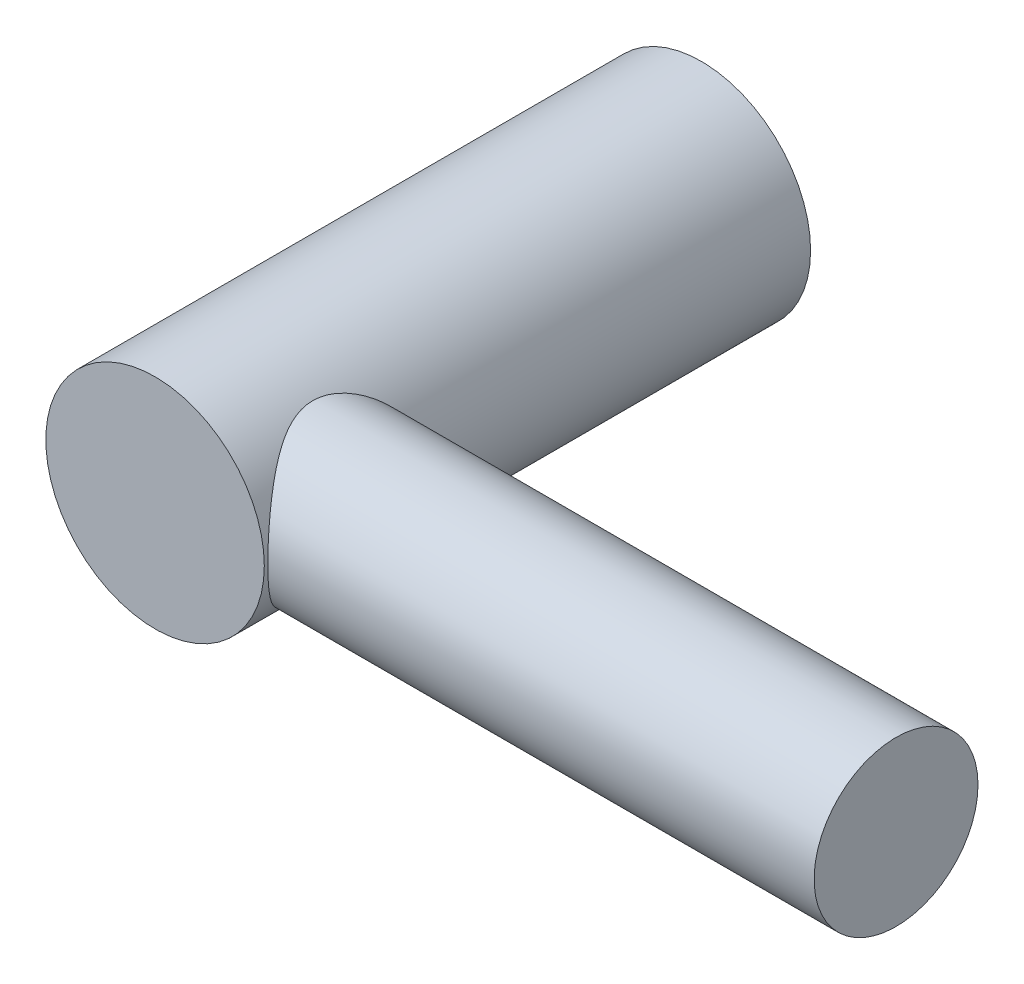
ISO-10303-21;
HEADER;
FILE_DESCRIPTION(('STEP AP214'),'2;1');
FILE_NAME('part.step','',(''),(''),'','','');
FILE_SCHEMA(('AUTOMOTIVE_DESIGN { 1 0 10303 214 1 1 1 1 }'));
ENDSEC;
DATA;
#1=APPLICATION_CONTEXT('core data for automotive mechanical design processes');
#2=APPLICATION_PROTOCOL_DEFINITION('international standard','automotive_design',2000,#1);
#3=PRODUCT_CONTEXT('',#1,'mechanical');
#4=PRODUCT('Part','Part','',(#3));
#5=PRODUCT_RELATED_PRODUCT_CATEGORY('part','',(#4));
#6=PRODUCT_DEFINITION_FORMATION('','',#4);
#7=PRODUCT_DEFINITION_CONTEXT('part definition',#1,'design');
#8=PRODUCT_DEFINITION('design','',#6,#7);
#9=PRODUCT_DEFINITION_SHAPE('','',#8);
#10=(LENGTH_UNIT() NAMED_UNIT(*) SI_UNIT(.MILLI.,.METRE.));
#11=(NAMED_UNIT(*) PLANE_ANGLE_UNIT() SI_UNIT($,.RADIAN.));
#12=(NAMED_UNIT(*) SI_UNIT($,.STERADIAN.) SOLID_ANGLE_UNIT());
#13=UNCERTAINTY_MEASURE_WITH_UNIT(LENGTH_MEASURE(1.E-05),#10,'distance_accuracy_value','');
#14=(GEOMETRIC_REPRESENTATION_CONTEXT(3) GLOBAL_UNCERTAINTY_ASSIGNED_CONTEXT((#13)) GLOBAL_UNIT_ASSIGNED_CONTEXT((#10,
#11,#12)) REPRESENTATION_CONTEXT('',''));
#15=CARTESIAN_POINT('',(0.,0.,0.));
#16=DIRECTION('',(0.,0.,1.));
#17=DIRECTION('',(1.,0.,0.));
#18=AXIS2_PLACEMENT_3D('',#15,#16,#17);
#19=CARTESIAN_POINT('',(0.,0.,127.));
#20=DIRECTION('',(0.,0.,-1.));
#21=DIRECTION('',(-1.,0.,0.));
#22=AXIS2_PLACEMENT_3D('',#19,#20,#21);
#23=CYLINDRICAL_SURFACE('',#22,25.4);
#24=CARTESIAN_POINT('',(0.,0.,127.));
#25=DIRECTION('',(0.,0.,1.));
#26=DIRECTION('',(1.,0.,0.));
#27=AXIS2_PLACEMENT_3D('',#24,#25,#26);
#28=CIRCLE('',#27,25.4);
#29=CARTESIAN_POINT('',(25.4,0.,127.));
#30=VERTEX_POINT('',#29);
#31=EDGE_CURVE('E49',#30,#30,#28,.T.);
#32=ORIENTED_EDGE('',*,*,#31,.F.);
#33=EDGE_LOOP('',(#32));
#34=FACE_BOUND('',#33,.T.);
#35=CARTESIAN_POINT('',(0.,0.,0.));
#36=DIRECTION('',(0.,0.,1.));
#37=DIRECTION('',(1.,0.,0.));
#38=AXIS2_PLACEMENT_3D('',#35,#36,#37);
#39=CIRCLE('',#38,25.4);
#40=CARTESIAN_POINT('',(25.4,0.,0.));
#41=VERTEX_POINT('',#40);
#42=EDGE_CURVE('E54',#41,#41,#39,.T.);
#43=ORIENTED_EDGE('',*,*,#42,.T.);
#44=EDGE_LOOP('',(#43));
#45=FACE_BOUND('',#44,.T.);
#46=CARTESIAN_POINT('',(25.4,0.,126.180880808135));
#47=CARTESIAN_POINT('',(25.3999955694252,-0.465196821907864,126.180876218484));
#48=CARTESIAN_POINT('',(25.3871888366441,-0.930510094409302,126.163809631571));
#49=CARTESIAN_POINT('',(25.3362495899845,-1.85746307731421,126.095809895394));
#50=CARTESIAN_POINT('',(25.2981019220369,-2.31910042221786,126.044856481533));
#51=CARTESIAN_POINT('',(25.1972726190303,-3.23582090044135,125.909780456927));
#52=CARTESIAN_POINT('',(25.1345371239571,-3.6908873555303,125.825585026024));
#53=CARTESIAN_POINT('',(24.9859845025974,-4.59001307096707,125.625377820164));
#54=CARTESIAN_POINT('',(24.900170502076,-5.03407381304574,125.509370353804));
#55=CARTESIAN_POINT('',(24.7078954805532,-5.90575235416346,125.24801032668));
#56=CARTESIAN_POINT('',(24.6015638368622,-6.33345405222188,125.102841424167));
#57=CARTESIAN_POINT('',(24.3700123692,-7.17301565294201,124.784546868779));
#58=CARTESIAN_POINT('',(24.2447919618977,-7.5848750658623,124.611420352493));
#59=CARTESIAN_POINT('',(23.9777989606178,-8.39078532352917,124.23918737281));
#60=CARTESIAN_POINT('',(23.8360349987545,-8.78484530811024,124.04009445187));
#61=CARTESIAN_POINT('',(23.5382356248951,-9.55414274713784,123.617647717798));
#62=CARTESIAN_POINT('',(23.3821981375452,-9.92937745208983,123.39429037576));
#63=CARTESIAN_POINT('',(23.0432649550616,-10.6938555699175,122.903292972261));
#64=CARTESIAN_POINT('',(22.8592199397203,-11.0811850628093,122.63346790742));
#65=CARTESIAN_POINT('',(22.4800976053072,-11.8313941144723,122.068788373852));
#66=CARTESIAN_POINT('',(22.2850196983235,-12.1942723680434,121.773932570885));
#67=CARTESIAN_POINT('',(21.8867244488676,-12.8955068114016,121.160341688144));
#68=CARTESIAN_POINT('',(21.6834960580407,-13.2338278396471,120.841573647519));
#69=CARTESIAN_POINT('',(21.2724225558764,-13.8849674146202,120.181745172406));
#70=CARTESIAN_POINT('',(21.0645770809105,-14.1977839435597,119.840682977956));
#71=CARTESIAN_POINT('',(20.6052986061375,-14.8584878552222,119.065589496318));
#72=CARTESIAN_POINT('',(20.3535947134563,-15.2005761289158,118.626754010538));
#73=CARTESIAN_POINT('',(19.8549738217362,-15.8463402470661,117.718915403858));
#74=CARTESIAN_POINT('',(19.6080582850647,-16.1500045084933,117.249903250083));
#75=CARTESIAN_POINT('',(19.1268141975133,-16.7171470898654,116.28257050475));
#76=CARTESIAN_POINT('',(18.8924732198518,-16.9806655759031,115.784279907573));
#77=CARTESIAN_POINT('',(18.5571075538942,-17.3441928635905,115.015156215811));
#78=CARTESIAN_POINT('',(18.4480297391198,-17.4600573097705,114.75522002502));
#79=CARTESIAN_POINT('',(18.2364701676264,-17.6809083369662,114.228040612122));
#80=CARTESIAN_POINT('',(18.1339898700048,-17.7858925148266,113.960795792142));
#81=CARTESIAN_POINT('',(17.90626126439,-18.0155349292991,113.334610744642));
#82=CARTESIAN_POINT('',(17.7838969106212,-18.1360988352811,112.973097621041));
#83=CARTESIAN_POINT('',(17.5563274612923,-18.3564831689463,112.238616446956));
#84=CARTESIAN_POINT('',(17.4511168623239,-18.4563102524152,111.865652116154));
#85=CARTESIAN_POINT('',(17.2614520508501,-18.6338172671358,111.110031768187));
#86=CARTESIAN_POINT('',(17.1769590292355,-18.7115386521804,110.727395376234));
#87=CARTESIAN_POINT('',(17.0317672126159,-18.8437945101333,109.953630299834));
#88=CARTESIAN_POINT('',(16.9710681226932,-18.8983292704328,109.562501720707));
#89=CARTESIAN_POINT('',(16.8757487554672,-18.9834999936288,108.770749064092));
#90=CARTESIAN_POINT('',(16.8413738539521,-19.0139111850337,108.370070706726));
#91=CARTESIAN_POINT('',(16.8013639865157,-19.0492756310542,107.566148853131));
#92=CARTESIAN_POINT('',(16.7957282320145,-19.0542295841967,107.16290542759));
#93=CARTESIAN_POINT('',(16.8134922365316,-19.03855581526,106.357438265919));
#94=CARTESIAN_POINT('',(16.8369014984218,-19.0179197206975,105.955214906684));
#95=CARTESIAN_POINT('',(16.911567781324,-18.9515525096957,105.155486801004));
#96=CARTESIAN_POINT('',(16.9628250860583,-18.9058211375799,104.757982102676));
#97=CARTESIAN_POINT('',(17.0838629298921,-18.7964750518226,104.012998634783));
#98=CARTESIAN_POINT('',(17.1510633707999,-18.7353080048471,103.664731557902));
#99=CARTESIAN_POINT('',(17.3034316903385,-18.5946768614931,102.975860203759));
#100=CARTESIAN_POINT('',(17.3886059879403,-18.5152062274581,102.635258712314));
#101=CARTESIAN_POINT('',(17.6674440447064,-18.2506697961157,101.626455126355));
#102=CARTESIAN_POINT('',(17.8844114944381,-18.0394893642072,100.971319499993));
#103=CARTESIAN_POINT('',(18.3159267556355,-17.6000887984212,99.8202432491685));
#104=CARTESIAN_POINT('',(18.5233675464491,-17.3824061365036,99.3174125142984));
#105=CARTESIAN_POINT('',(18.9570887900292,-16.9083417829502,98.3384884802466));
#106=CARTESIAN_POINT('',(19.1833788779193,-16.651940244423,97.8624090662331));
#107=CARTESIAN_POINT('',(19.6473533512863,-16.1019028169848,96.9366763116642));
#108=CARTESIAN_POINT('',(19.8850604149227,-15.8081907385489,96.4870798803287));
#109=CARTESIAN_POINT('',(20.3647431178748,-15.1852491417092,95.6157854543729));
#110=CARTESIAN_POINT('',(20.6067180829718,-14.8560251919691,95.1940831023278));
#111=CARTESIAN_POINT('',(21.0952456715835,-14.1540822313656,94.3690176552369));
#112=CARTESIAN_POINT('',(21.3417596123327,-13.7804748904734,93.9663864593898));
#113=CARTESIAN_POINT('',(21.8274952499575,-12.9974158902069,93.1927080308499));
#114=CARTESIAN_POINT('',(22.0667162067224,-12.5879606091096,92.8216639968994));
#115=CARTESIAN_POINT('',(22.5320788928393,-11.7346107345011,92.1139569827925));
#116=CARTESIAN_POINT('',(22.7582420740623,-11.2907756040118,91.7772368741202));
#117=CARTESIAN_POINT('',(23.0839340784816,-10.5998524884099,91.2997723492789));
#118=CARTESIAN_POINT('',(23.19023306748,-10.3653651492025,91.1452289068765));
#119=CARTESIAN_POINT('',(23.3977268917874,-9.88807867733168,90.8456787824916));
#120=CARTESIAN_POINT('',(23.4989204214994,-9.64527744497333,90.7006745370742));
#121=CARTESIAN_POINT('',(23.7543576629152,-9.00392961394585,90.3369111207552));
#122=CARTESIAN_POINT('',(23.9041152986923,-8.59911928974265,90.1259341403439));
#123=CARTESIAN_POINT('',(24.1861770937552,-7.77047989948514,89.731667518241));
#124=CARTESIAN_POINT('',(24.3184848420886,-7.34665476845533,89.548372181932));
#125=CARTESIAN_POINT('',(24.5631195965108,-6.48189351433479,89.211540856131));
#126=CARTESIAN_POINT('',(24.6754540806684,-6.04096387088199,89.0579937268549));
#127=CARTESIAN_POINT('',(24.8778534752721,-5.14428133279596,88.7826162089216));
#128=CARTESIAN_POINT('',(24.9679180997133,-4.68852824787488,88.6607862275969));
#129=CARTESIAN_POINT('',(25.1242236562066,-3.76234995010276,88.4500310404731));
#130=CARTESIAN_POINT('',(25.1903122724232,-3.2918508754292,88.3613161099756));
#131=CARTESIAN_POINT('',(25.2962517824771,-2.34258342898491,88.2193739972543));
#132=CARTESIAN_POINT('',(25.3361026124258,-1.86381503708143,88.166146901443));
#133=CARTESIAN_POINT('',(25.3885332963832,-0.902285480790174,88.0961582973697));
#134=CARTESIAN_POINT('',(25.4011222444882,-0.41952570182072,88.0793846288629));
#135=CARTESIAN_POINT('',(25.3987208633536,0.545780310851124,88.0825861772145));
#136=CARTESIAN_POINT('',(25.3837327073245,1.02832655838342,88.1025584983096));
#137=CARTESIAN_POINT('',(25.3294666622592,1.9404667220794,88.1750142787715));
#138=CARTESIAN_POINT('',(25.2927871613343,2.37049899451594,88.2240207691529));
#139=CARTESIAN_POINT('',(25.1982272327591,3.22391477813419,88.3507068096122));
#140=CARTESIAN_POINT('',(25.1403484969503,3.64729881707849,88.4283840715734));
#141=CARTESIAN_POINT('',(25.0045300021525,4.48480794260528,88.6113566473878));
#142=CARTESIAN_POINT('',(24.9265875654571,4.89893178529554,88.7166556476805));
#143=CARTESIAN_POINT('',(24.7521044375829,5.71556588865861,88.953543565045));
#144=CARTESIAN_POINT('',(24.6555628170498,6.11807556784494,89.0851337958355));
#145=CARTESIAN_POINT('',(24.4418713177933,6.92347991834859,89.3781913904705));
#146=CARTESIAN_POINT('',(24.3241158174691,7.32588976006487,89.5405471298904));
#147=CARTESIAN_POINT('',(24.0725179943909,8.1145064680642,89.8901340506637));
#148=CARTESIAN_POINT('',(23.9386754852416,8.50071314653615,90.0773655202474));
#149=CARTESIAN_POINT('',(23.657039330911,9.25563589232403,90.4750195239996));
#150=CARTESIAN_POINT('',(23.5092465088556,9.62435298967102,90.6854406900027));
#151=CARTESIAN_POINT('',(23.2018578278938,10.3434393683576,91.1279424096358));
#152=CARTESIAN_POINT('',(23.0422602733677,10.6938060014614,91.360026076104));
#153=CARTESIAN_POINT('',(22.6859990260371,11.4324291667047,91.8848918430341));
#154=CARTESIAN_POINT('',(22.4875955392601,11.8172456660215,92.1813387927627));
#155=CARTESIAN_POINT('',(22.0812058738139,12.5602427323282,92.7999163490534));
#156=CARTESIAN_POINT('',(21.8732187638251,12.9184207017538,93.1220494539823));
#157=CARTESIAN_POINT('',(21.4508023195588,13.6083430994951,93.7912057445811));
#158=CARTESIAN_POINT('',(21.2363603809067,13.9400304732928,94.1382797489186));
#159=CARTESIAN_POINT('',(20.8052156722564,14.5756824404064,94.8556343723598));
#160=CARTESIAN_POINT('',(20.5885127708258,14.8796454119533,95.2259163469041));
#161=CARTESIAN_POINT('',(20.1158183002895,15.514467710058,96.0615940517859));
#162=CARTESIAN_POINT('',(19.8601929075557,15.8394477228327,96.5316856892083));
#163=CARTESIAN_POINT('',(19.3590820922561,16.4481422878503,97.5033230643615));
#164=CARTESIAN_POINT('',(19.1136004188352,16.7318416786395,98.0048802623866));
#165=CARTESIAN_POINT('',(18.6425576220152,17.2551047985228,99.0377794382077));
#166=CARTESIAN_POINT('',(18.4169503424346,17.4947722733165,99.5690474542082));
#167=CARTESIAN_POINT('',(17.9959967088637,17.9274987860611,100.661580427998));
#168=CARTESIAN_POINT('',(17.8006253154702,18.1205964649081,101.222820041475));
#169=CARTESIAN_POINT('',(17.5203331420515,18.3907530069384,102.149241631792));
#170=CARTESIAN_POINT('',(17.4220064990112,18.483734830586,102.50578799506));
#171=CARTESIAN_POINT('',(17.244307665194,18.6496283657162,103.2281756779));
#172=CARTESIAN_POINT('',(17.1649320549176,18.7225436983332,103.594015307406));
#173=CARTESIAN_POINT('',(17.0281034274143,18.8470760014138,104.332631769196));
#174=CARTESIAN_POINT('',(16.97060806277,18.8987341293764,104.705393721447));
#175=CARTESIAN_POINT('',(16.8796629632303,18.9800086102033,105.45626442425));
#176=CARTESIAN_POINT('',(16.8462132890903,19.0096249073754,105.83437318831));
#177=CARTESIAN_POINT('',(16.8047515748885,19.0462887455106,106.595056669463));
#178=CARTESIAN_POINT('',(16.7968715988037,19.0532191184031,106.977644361641));
#179=CARTESIAN_POINT('',(16.8072920206122,19.0440273386536,107.742170079098));
#180=CARTESIAN_POINT('',(16.8255918683122,19.0279056704717,108.124108117861));
#181=CARTESIAN_POINT('',(16.8875527470621,18.9729348477952,108.884673723393));
#182=CARTESIAN_POINT('',(16.9312419422019,18.9340604536397,109.263297139085));
#183=CARTESIAN_POINT('',(17.042086970668,18.8343512497947,110.014147623231));
#184=CARTESIAN_POINT('',(17.1092460798682,18.7735133744563,110.386373791159));
#185=CARTESIAN_POINT('',(17.2813454800192,18.6153584931601,111.202661181016));
#186=CARTESIAN_POINT('',(17.391331777426,18.5129786813216,111.644678071268));
#187=CARTESIAN_POINT('',(17.6368315595427,18.2792456767531,112.513660067771));
#188=CARTESIAN_POINT('',(17.772351453672,18.1478852079076,112.940621362765));
#189=CARTESIAN_POINT('',(18.0637748943173,17.8578372316934,113.778987279115));
#190=CARTESIAN_POINT('',(18.2197200747012,17.6990936926625,114.190357850844));
#191=CARTESIAN_POINT('',(18.5467559978669,17.3560947568035,114.996006365802));
#192=CARTESIAN_POINT('',(18.717847644031,17.1718378379078,115.390283287421));
#193=CARTESIAN_POINT('',(19.1319792156324,16.7108850788873,116.295418250439));
#194=CARTESIAN_POINT('',(19.3793859256337,16.4242978327386,116.799261175853));
#195=CARTESIAN_POINT('',(19.8843594518939,15.8091987062656,117.775346153123));
#196=CARTESIAN_POINT('',(20.1419294165212,15.4806737629274,118.24757828849));
#197=CARTESIAN_POINT('',(20.659564438357,14.7828042154238,119.160066347327));
#198=CARTESIAN_POINT('',(20.9196312292164,14.4134290432834,119.60029791113));
#199=CARTESIAN_POINT('',(21.4351264251696,13.6350023576517,120.447031295628));
#200=CARTESIAN_POINT('',(21.6905553895093,13.2259556661277,120.853537204469));
#201=CARTESIAN_POINT('',(22.192549080545,12.3653154931882,121.634043501612));
#202=CARTESIAN_POINT('',(22.4390212358863,11.9133932406115,122.007741895314));
#203=CARTESIAN_POINT('',(22.914564531187,10.9709301724119,122.715761987423));
#204=CARTESIAN_POINT('',(23.1436333945963,10.4803843214117,123.050078537372));
#205=CARTESIAN_POINT('',(23.5777088403533,9.46344131330644,123.674797847258));
#206=CARTESIAN_POINT('',(23.7827608545224,8.93711492388294,123.965283830257));
#207=CARTESIAN_POINT('',(24.1631335780032,7.85071422427325,124.498506862102));
#208=CARTESIAN_POINT('',(24.3384696248388,7.29065752712671,124.741268553655));
#209=CARTESIAN_POINT('',(24.6074206921846,6.30971549774152,125.1108307082));
#210=CARTESIAN_POINT('',(24.7099246828251,5.8961590120276,125.250763377383));
#211=CARTESIAN_POINT('',(24.8953502622424,5.05631548629689,125.502823383344));
#212=CARTESIAN_POINT('',(24.978272720751,4.63002901264193,125.614951955078));
#213=CARTESIAN_POINT('',(25.1227035877005,3.76831450681627,125.80966513688));
#214=CARTESIAN_POINT('',(25.1842635765753,3.33291122392689,125.892320923512));
#215=CARTESIAN_POINT('',(25.2849343337543,2.45501262339375,126.027241182121));
#216=CARTESIAN_POINT('',(25.3240565821103,2.01252105174705,126.079521195746));
#217=CARTESIAN_POINT('',(25.3676594983005,1.3076832038201,126.137743484878));
#218=CARTESIAN_POINT('',(25.3797763369838,1.0465942016105,126.153908935528));
#219=CARTESIAN_POINT('',(25.3959484836878,0.523682506556465,126.175479754987));
#220=CARTESIAN_POINT('',(25.4000024939745,0.261859702394705,126.180883391654));
#221=CARTESIAN_POINT('',(25.4,0.,126.180880808135));
#222=B_SPLINE_CURVE_WITH_KNOTS('',3,(#46,#47,#48,#49,#50,#51,#52,#53,#54,#55,#56,#57,#58,#59,
#60,#61,#62,#63,#64,#65,#66,#67,#68,#69,#70,#71,#72,#73,#74,#75,#76,#77,#78,#79,#80,#81,#82,#83,
#84,#85,#86,#87,#88,#89,#90,#91,#92,#93,#94,#95,#96,#97,#98,#99,#100,#101,#102,#103,#104,#105,
#106,#107,#108,#109,#110,#111,#112,#113,#114,#115,#116,#117,#118,#119,#120,#121,#122,#123,#124,
#125,#126,#127,#128,#129,#130,#131,#132,#133,#134,#135,#136,#137,#138,#139,#140,#141,#142,#143,
#144,#145,#146,#147,#148,#149,#150,#151,#152,#153,#154,#155,#156,#157,#158,#159,#160,#161,#162,
#163,#164,#165,#166,#167,#168,#169,#170,#171,#172,#173,#174,#175,#176,#177,#178,#179,#180,#181,
#182,#183,#184,#185,#186,#187,#188,#189,#190,#191,#192,#193,#194,#195,#196,#197,#198,#199,#200,
#201,#202,#203,#204,#205,#206,#207,#208,#209,#210,#211,#212,#213,#214,#215,#216,#217,#218,#219,
#220,#221),.UNSPECIFIED.,.T.,.F.,(4,2,2,2,2,2,2,2,2,2,2,2,2,2,2,2,2,2,2,2,2,2,2,2,2,2,2,2,2,2,2,
2,2,2,2,2,2,2,2,2,2,2,2,2,2,2,2,2,2,2,2,2,2,2,2,2,2,2,2,2,2,2,2,2,2,2,2,2,2,2,2,2,2,2,2,2,2,2,2,
2,2,2,2,2,2,2,2,4),(0.,1.39530787840669,2.79145091343781,4.19066946954248,5.58969861008774,
6.98017836720727,8.37070107451591,9.76050145039649,11.1505042238023,12.6690602641655,
14.1876973004968,15.7084675290337,17.2293579567736,19.0594458716691,20.8900841641509,
22.7188786902305,23.6329181615865,24.5471590910524,25.7469034572387,26.9462621509499,
28.1433566864146,29.3404363838286,30.5485429977222,31.7566164619263,32.9650852846703,
34.1735664198033,35.2522786916754,36.3313768560475,38.4897732806648,40.2453081484072,
42.0017459588414,43.7618299421943,45.5216383245871,47.3258805967257,49.1303053625585,
50.9316760600012,51.832248886915,52.7330508580965,54.1728353683336,55.6123232840751,
57.0512711097552,58.4902374144393,59.9381914683657,61.3861490480265,62.8336235394168,
64.2809839676355,65.5825726888303,66.8840575571114,68.1857162120097,69.4874399243845,
70.8349682758231,72.1825122421686,73.5299767474966,74.8776351785201,76.4502890467619,
78.023096066391,79.5992039831393,81.1754040369789,83.051376447944,84.9280361320676,
86.8002157764392,88.670836609418,89.813982741756,90.9569224501513,92.0976387043483,
93.2383578407441,94.384959334589,95.5315367318891,96.6793884477508,97.8274004420182,
99.2258654532679,100.624681974707,102.026395485689,103.428192655627,105.316362334967,
107.205121594799,109.095303888805,110.985256723438,112.891097901818,114.797187958355,
116.699612016994,118.60105115305,119.945109707718,121.289108553557,122.629839311103,
123.96988348343,124.75517713705,125.540597175583),.UNSPECIFIED.);
#223=CARTESIAN_POINT('',(25.4,0.,126.180880808135));
#224=VERTEX_POINT('',#223);
#225=EDGE_CURVE('E10',#224,#224,#222,.T.);
#226=ORIENTED_EDGE('',*,*,#225,.F.);
#227=EDGE_LOOP('',(#226));
#228=FACE_BOUND('',#227,.T.);
#229=ADVANCED_FACE('F37',(#34,#45,#228),#23,.T.);
#230=CARTESIAN_POINT('',(0.,0.,127.));
#231=DIRECTION('',(0.,0.,1.));
#232=DIRECTION('',(1.,0.,0.));
#233=AXIS2_PLACEMENT_3D('',#230,#231,#232);
#234=PLANE('',#233);
#235=ORIENTED_EDGE('',*,*,#31,.T.);
#236=EDGE_LOOP('',(#235));
#237=FACE_BOUND('',#236,.T.);
#238=ADVANCED_FACE('F76',(#237),#234,.T.);
#239=CARTESIAN_POINT('',(0.,0.,0.));
#240=DIRECTION('',(0.,0.,1.));
#241=DIRECTION('',(1.,0.,0.));
#242=AXIS2_PLACEMENT_3D('',#239,#240,#241);
#243=PLANE('',#242);
#244=ORIENTED_EDGE('',*,*,#42,.F.);
#245=EDGE_LOOP('',(#244));
#246=FACE_BOUND('',#245,.T.);
#247=ADVANCED_FACE('F70',(#246),#243,.F.);
#248=CARTESIAN_POINT('',(152.4,0.,107.130880808135));
#249=DIRECTION('',(-1.,0.,0.));
#250=DIRECTION('',(0.,0.,1.));
#251=AXIS2_PLACEMENT_3D('',#248,#249,#250);
#252=CYLINDRICAL_SURFACE('',#251,19.05);
#253=CARTESIAN_POINT('',(152.4,0.,107.130880808135));
#254=DIRECTION('',(1.,0.,0.));
#255=DIRECTION('',(0.,0.,-1.));
#256=AXIS2_PLACEMENT_3D('',#253,#254,#255);
#257=CIRCLE('',#256,19.05);
#258=CARTESIAN_POINT('',(152.4,0.,88.0808808081351));
#259=VERTEX_POINT('',#258);
#260=EDGE_CURVE('E60',#259,#259,#257,.T.);
#261=ORIENTED_EDGE('',*,*,#260,.F.);
#262=EDGE_LOOP('',(#261));
#263=FACE_BOUND('',#262,.T.);
#264=ORIENTED_EDGE('',*,*,#225,.T.);
#265=EDGE_LOOP('',(#264));
#266=FACE_BOUND('',#265,.T.);
#267=ADVANCED_FACE('F68',(#263,#266),#252,.T.);
#268=CARTESIAN_POINT('',(152.4,0.,107.130880808135));
#269=DIRECTION('',(1.,0.,0.));
#270=DIRECTION('',(0.,0.,-1.));
#271=AXIS2_PLACEMENT_3D('',#268,#269,#270);
#272=PLANE('',#271);
#273=ORIENTED_EDGE('',*,*,#260,.T.);
#274=EDGE_LOOP('',(#273));
#275=FACE_BOUND('',#274,.T.);
#276=ADVANCED_FACE('F66',(#275),#272,.T.);
#277=CLOSED_SHELL('',(#229,#238,#247,#267,#276));
#278=MANIFOLD_SOLID_BREP('B2',#277);
#279=ADVANCED_BREP_SHAPE_REPRESENTATION('',(#18,#278),#14);
#280=SHAPE_DEFINITION_REPRESENTATION(#9,#279);
ENDSEC;
END-ISO-10303-21;
